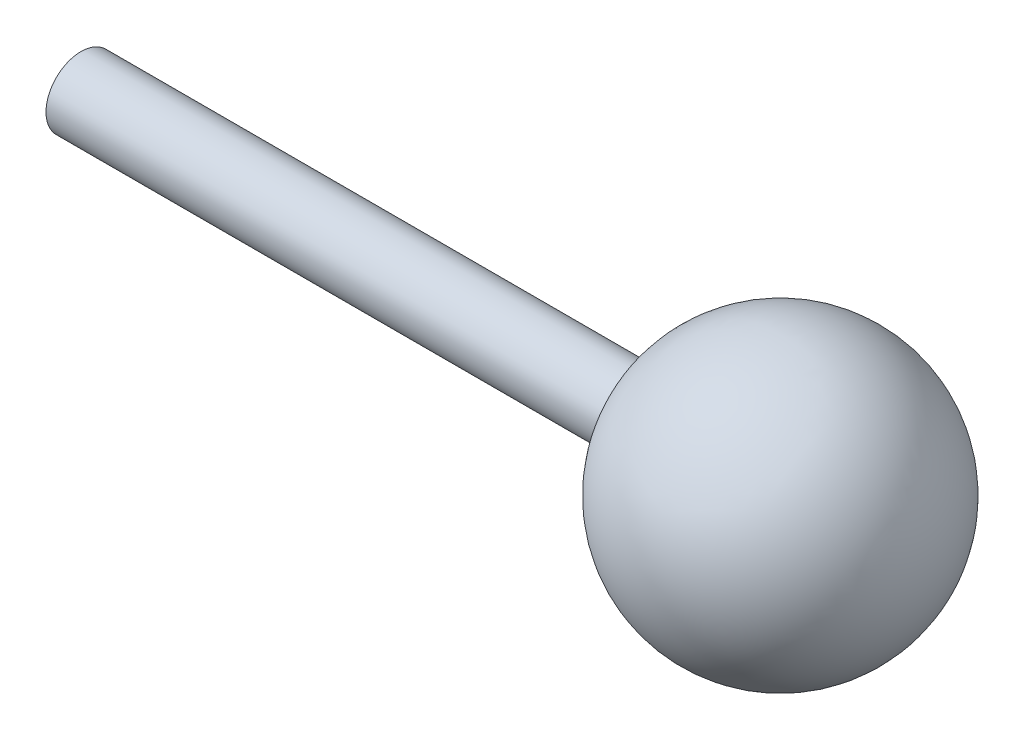
ISO-10303-21;
HEADER;
FILE_DESCRIPTION(('STEP AP214'),'2;1');
FILE_NAME('part.step','',(''),(''),'','','');
FILE_SCHEMA(('AUTOMOTIVE_DESIGN { 1 0 10303 214 1 1 1 1 }'));
ENDSEC;
DATA;
#1=APPLICATION_CONTEXT('core data for automotive mechanical design processes');
#2=APPLICATION_PROTOCOL_DEFINITION('international standard','automotive_design',2000,#1);
#3=PRODUCT_CONTEXT('',#1,'mechanical');
#4=PRODUCT('Part','Part','',(#3));
#5=PRODUCT_RELATED_PRODUCT_CATEGORY('part','',(#4));
#6=PRODUCT_DEFINITION_FORMATION('','',#4);
#7=PRODUCT_DEFINITION_CONTEXT('part definition',#1,'design');
#8=PRODUCT_DEFINITION('design','',#6,#7);
#9=PRODUCT_DEFINITION_SHAPE('','',#8);
#10=(LENGTH_UNIT() NAMED_UNIT(*) SI_UNIT(.MILLI.,.METRE.));
#11=(NAMED_UNIT(*) PLANE_ANGLE_UNIT() SI_UNIT($,.RADIAN.));
#12=(NAMED_UNIT(*) SI_UNIT($,.STERADIAN.) SOLID_ANGLE_UNIT());
#13=UNCERTAINTY_MEASURE_WITH_UNIT(LENGTH_MEASURE(1.E-05),#10,'distance_accuracy_value','');
#14=(GEOMETRIC_REPRESENTATION_CONTEXT(3) GLOBAL_UNCERTAINTY_ASSIGNED_CONTEXT((#13)) GLOBAL_UNIT_ASSIGNED_CONTEXT((#10,
#11,#12)) REPRESENTATION_CONTEXT('',''));
#15=CARTESIAN_POINT('',(0.,0.,0.));
#16=DIRECTION('',(0.,0.,1.));
#17=DIRECTION('',(1.,0.,0.));
#18=AXIS2_PLACEMENT_3D('',#15,#16,#17);
#19=CARTESIAN_POINT('',(0.,0.,0.));
#20=DIRECTION('',(1.,0.,0.));
#21=DIRECTION('',(0.,0.,-1.));
#22=AXIS2_PLACEMENT_3D('',#19,#20,#21);
#23=PLANE('',#22);
#24=CARTESIAN_POINT('',(0.,0.,0.));
#25=DIRECTION('',(-1.,0.,0.));
#26=DIRECTION('',(0.,0.,1.));
#27=AXIS2_PLACEMENT_3D('',#24,#25,#26);
#28=CIRCLE('',#27,12.5);
#29=CARTESIAN_POINT('',(0.,0.,12.5));
#30=VERTEX_POINT('',#29);
#31=EDGE_CURVE('E10',#30,#30,#28,.T.);
#32=ORIENTED_EDGE('',*,*,#31,.T.);
#33=EDGE_LOOP('',(#32));
#34=FACE_BOUND('',#33,.T.);
#35=ADVANCED_FACE('F35',(#34),#23,.F.);
#36=CARTESIAN_POINT('',(-17.8024455574394,0.,0.));
#37=DIRECTION('',(-1.,0.,0.));
#38=DIRECTION('',(0.,0.,1.));
#39=AXIS2_PLACEMENT_3D('',#36,#37,#38);
#40=CYLINDRICAL_SURFACE('',#39,12.5);
#41=ORIENTED_EDGE('',*,*,#31,.F.);
#42=EDGE_LOOP('',(#41));
#43=FACE_BOUND('',#42,.T.);
#44=CARTESIAN_POINT('',(201.587708172407,0.,0.));
#45=DIRECTION('',(-1.,0.,0.));
#46=DIRECTION('',(0.,0.,1.));
#47=AXIS2_PLACEMENT_3D('',#44,#45,#46);
#48=CIRCLE('',#47,12.5);
#49=CARTESIAN_POINT('',(201.587708172407,0.,12.5));
#50=VERTEX_POINT('',#49);
#51=EDGE_CURVE('E41',#50,#50,#48,.T.);
#52=ORIENTED_EDGE('',*,*,#51,.T.);
#53=EDGE_LOOP('',(#52));
#54=FACE_BOUND('',#53,.T.);
#55=ADVANCED_FACE('F47',(#43,#54),#40,.T.);
#56=CARTESIAN_POINT('',(250.,0.,0.));
#57=DIRECTION('',(-1.,0.,0.));
#58=DIRECTION('',(0.,1.,0.));
#59=AXIS2_PLACEMENT_3D('',#56,#57,#58);
#60=SPHERICAL_SURFACE('',#59,50.);
#61=ORIENTED_EDGE('',*,*,#51,.F.);
#62=EDGE_LOOP('',(#61));
#63=FACE_BOUND('',#62,.T.);
#64=ADVANCED_FACE('F49',(#63),#60,.T.);
#65=CLOSED_SHELL('',(#35,#55,#64));
#66=MANIFOLD_SOLID_BREP('B2',#65);
#67=ADVANCED_BREP_SHAPE_REPRESENTATION('',(#18,#66),#14);
#68=SHAPE_DEFINITION_REPRESENTATION(#9,#67);
ENDSEC;
END-ISO-10303-21;
